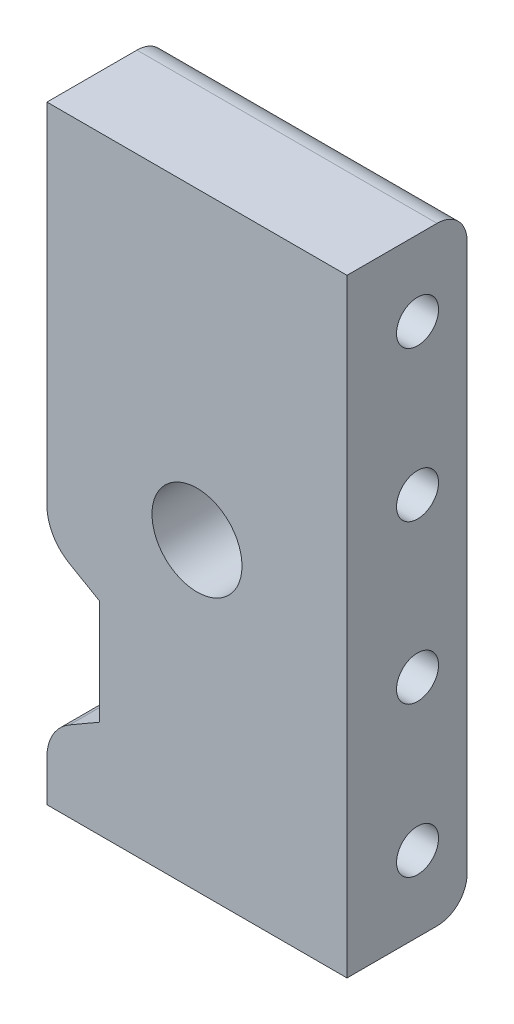
ISO-10303-21;
HEADER;
FILE_DESCRIPTION(('STEP AP214'),'2;1');
FILE_NAME('part.step','',(''),(''),'','','');
FILE_SCHEMA(('AUTOMOTIVE_DESIGN { 1 0 10303 214 1 1 1 1 }'));
ENDSEC;
DATA;
#1=APPLICATION_CONTEXT('core data for automotive mechanical design processes');
#2=APPLICATION_PROTOCOL_DEFINITION('international standard','automotive_design',2000,#1);
#3=PRODUCT_CONTEXT('',#1,'mechanical');
#4=PRODUCT('Part','Part','',(#3));
#5=PRODUCT_RELATED_PRODUCT_CATEGORY('part','',(#4));
#6=PRODUCT_DEFINITION_FORMATION('','',#4);
#7=PRODUCT_DEFINITION_CONTEXT('part definition',#1,'design');
#8=PRODUCT_DEFINITION('design','',#6,#7);
#9=PRODUCT_DEFINITION_SHAPE('','',#8);
#10=(LENGTH_UNIT() NAMED_UNIT(*) SI_UNIT(.MILLI.,.METRE.));
#11=(NAMED_UNIT(*) PLANE_ANGLE_UNIT() SI_UNIT($,.RADIAN.));
#12=(NAMED_UNIT(*) SI_UNIT($,.STERADIAN.) SOLID_ANGLE_UNIT());
#13=UNCERTAINTY_MEASURE_WITH_UNIT(LENGTH_MEASURE(1.E-05),#10,'distance_accuracy_value','');
#14=(GEOMETRIC_REPRESENTATION_CONTEXT(3) GLOBAL_UNCERTAINTY_ASSIGNED_CONTEXT((#13)) GLOBAL_UNIT_ASSIGNED_CONTEXT((#10,
#11,#12)) REPRESENTATION_CONTEXT('',''));
#15=CARTESIAN_POINT('',(0.,0.,0.));
#16=DIRECTION('',(0.,0.,1.));
#17=DIRECTION('',(1.,0.,0.));
#18=AXIS2_PLACEMENT_3D('',#15,#16,#17);
#19=CARTESIAN_POINT('',(-10.,20.28038,-8.));
#20=DIRECTION('',(-1.,0.,0.));
#21=DIRECTION('',(0.,-1.,0.));
#22=AXIS2_PLACEMENT_3D('',#19,#20,#21);
#23=PLANE('',#22);
#24=DIRECTION('',(0.,-1.,0.));
#25=VECTOR('',#24,1.);
#26=CARTESIAN_POINT('',(-10.,20.28038,-8.));
#27=LINE('',#26,#25);
#28=CARTESIAN_POINT('',(-10.,20.28038,-8.));
#29=VERTEX_POINT('',#28);
#30=CARTESIAN_POINT('',(-10.,-3.01239325026743,-8.));
#31=VERTEX_POINT('',#30);
#32=EDGE_CURVE('E197',#29,#31,#27,.T.);
#33=ORIENTED_EDGE('',*,*,#32,.F.);
#34=DIRECTION('',(0.,0.,-1.));
#35=VECTOR('',#34,1.);
#36=CARTESIAN_POINT('',(-10.,20.28038,-8.));
#37=LINE('',#36,#35);
#38=CARTESIAN_POINT('',(-10.,20.28038,-14.));
#39=VERTEX_POINT('',#38);
#40=EDGE_CURVE('E204',#29,#39,#37,.T.);
#41=ORIENTED_EDGE('',*,*,#40,.T.);
#42=CARTESIAN_POINT('',(-10.,18.28038,-14.));
#43=DIRECTION('',(1.,0.,0.));
#44=DIRECTION('',(0.,-1.,0.));
#45=AXIS2_PLACEMENT_3D('',#42,#43,#44);
#46=CIRCLE('',#45,2.);
#47=CARTESIAN_POINT('',(-10.,18.28038,-16.));
#48=VERTEX_POINT('',#47);
#49=EDGE_CURVE('E234',#48,#39,#46,.T.);
#50=ORIENTED_EDGE('',*,*,#49,.F.);
#51=DIRECTION('',(0.,-1.,0.));
#52=VECTOR('',#51,1.);
#53=CARTESIAN_POINT('',(-10.,20.28038,-16.));
#54=LINE('',#53,#52);
#55=CARTESIAN_POINT('',(-10.,-3.01239325026743,-16.));
#56=VERTEX_POINT('',#55);
#57=EDGE_CURVE('E205',#48,#56,#54,.T.);
#58=ORIENTED_EDGE('',*,*,#57,.T.);
#59=DIRECTION('',(0.,0.,-1.));
#60=VECTOR('',#59,1.);
#61=CARTESIAN_POINT('',(-10.,-3.01239325026743,-8.));
#62=LINE('',#61,#60);
#63=EDGE_CURVE('E44',#31,#56,#62,.T.);
#64=ORIENTED_EDGE('',*,*,#63,.F.);
#65=EDGE_LOOP('',(#33,#41,#50,#58,#64));
#66=FACE_BOUND('',#65,.T.);
#67=ADVANCED_FACE('F36',(#66),#23,.T.);
#68=CARTESIAN_POINT('',(9.99999999999999,20.28038,-8.));
#69=DIRECTION('',(0.,1.,0.));
#70=DIRECTION('',(-1.,0.,0.));
#71=AXIS2_PLACEMENT_3D('',#68,#69,#70);
#72=PLANE('',#71);
#73=ORIENTED_EDGE('',*,*,#40,.F.);
#74=DIRECTION('',(-1.,0.,0.));
#75=VECTOR('',#74,1.);
#76=CARTESIAN_POINT('',(9.99999999999999,20.28038,-8.));
#77=LINE('',#76,#75);
#78=CARTESIAN_POINT('',(9.99999999999999,20.28038,-8.));
#79=VERTEX_POINT('',#78);
#80=EDGE_CURVE('E193',#79,#29,#77,.T.);
#81=ORIENTED_EDGE('',*,*,#80,.F.);
#82=DIRECTION('',(0.,0.,-1.));
#83=VECTOR('',#82,1.);
#84=CARTESIAN_POINT('',(9.99999999999999,20.28038,-8.));
#85=LINE('',#84,#83);
#86=CARTESIAN_POINT('',(9.99999999999999,20.28038,-14.));
#87=VERTEX_POINT('',#86);
#88=EDGE_CURVE('E210',#79,#87,#85,.T.);
#89=ORIENTED_EDGE('',*,*,#88,.T.);
#90=DIRECTION('',(-1.,0.,0.));
#91=VECTOR('',#90,1.);
#92=CARTESIAN_POINT('',(9.99999999999999,20.28038,-14.));
#93=LINE('',#92,#91);
#94=EDGE_CURVE('E240',#39,#87,#93,.F.);
#95=ORIENTED_EDGE('',*,*,#94,.F.);
#96=EDGE_LOOP('',(#73,#81,#89,#95));
#97=FACE_BOUND('',#96,.T.);
#98=ADVANCED_FACE('F294',(#97),#72,.T.);
#99=CARTESIAN_POINT('',(9.99999999999999,-20.28038,-8.));
#100=DIRECTION('',(1.,0.,0.));
#101=DIRECTION('',(0.,0.,1.));
#102=AXIS2_PLACEMENT_3D('',#99,#100,#101);
#103=PLANE('',#102);
#104=CARTESIAN_POINT('',(9.99999999999999,-15.26519,-12.7));
#105=DIRECTION('',(-1.,0.,0.));
#106=DIRECTION('',(0.,0.,-1.));
#107=AXIS2_PLACEMENT_3D('',#104,#105,#106);
#108=CIRCLE('',#107,1.4);
#109=CARTESIAN_POINT('',(9.99999999999999,-15.26519,-14.1));
#110=VERTEX_POINT('',#109);
#111=EDGE_CURVE('E173',#110,#110,#108,.T.);
#112=ORIENTED_EDGE('',*,*,#111,.T.);
#113=EDGE_LOOP('',(#112));
#114=FACE_BOUND('',#113,.T.);
#115=CARTESIAN_POINT('',(9.99999999999999,5.26519,-12.7));
#116=DIRECTION('',(-1.,0.,0.));
#117=DIRECTION('',(0.,0.,-1.));
#118=AXIS2_PLACEMENT_3D('',#115,#116,#117);
#119=CIRCLE('',#118,1.4);
#120=CARTESIAN_POINT('',(9.99999999999999,5.26519,-14.1));
#121=VERTEX_POINT('',#120);
#122=EDGE_CURVE('E168',#121,#121,#119,.T.);
#123=ORIENTED_EDGE('',*,*,#122,.T.);
#124=EDGE_LOOP('',(#123));
#125=FACE_BOUND('',#124,.T.);
#126=CARTESIAN_POINT('',(9.99999999999999,15.26519,-12.7));
#127=DIRECTION('',(-1.,0.,0.));
#128=DIRECTION('',(0.,0.,1.));
#129=AXIS2_PLACEMENT_3D('',#126,#127,#128);
#130=CIRCLE('',#129,1.4);
#131=CARTESIAN_POINT('',(9.99999999999999,15.26519,-11.3));
#132=VERTEX_POINT('',#131);
#133=EDGE_CURVE('E180',#132,#132,#130,.T.);
#134=ORIENTED_EDGE('',*,*,#133,.T.);
#135=EDGE_LOOP('',(#134));
#136=FACE_BOUND('',#135,.T.);
#137=CARTESIAN_POINT('',(9.99999999999999,-5.26519,-12.7));
#138=DIRECTION('',(-1.,0.,0.));
#139=DIRECTION('',(0.,0.,1.));
#140=AXIS2_PLACEMENT_3D('',#137,#138,#139);
#141=CIRCLE('',#140,1.4);
#142=CARTESIAN_POINT('',(9.99999999999999,-5.26519,-11.3));
#143=VERTEX_POINT('',#142);
#144=EDGE_CURVE('E185',#143,#143,#141,.T.);
#145=ORIENTED_EDGE('',*,*,#144,.T.);
#146=EDGE_LOOP('',(#145));
#147=FACE_BOUND('',#146,.T.);
#148=DIRECTION('',(0.,1.,0.));
#149=VECTOR('',#148,1.);
#150=CARTESIAN_POINT('',(9.99999999999999,-20.28038,-16.));
#151=LINE('',#150,#149);
#152=CARTESIAN_POINT('',(9.99999999999999,-18.28038,-16.));
#153=VERTEX_POINT('',#152);
#154=CARTESIAN_POINT('',(9.99999999999999,18.28038,-16.));
#155=VERTEX_POINT('',#154);
#156=EDGE_CURVE('E196',#153,#155,#151,.T.);
#157=ORIENTED_EDGE('',*,*,#156,.T.);
#158=CARTESIAN_POINT('',(9.99999999999999,18.28038,-14.));
#159=DIRECTION('',(-1.,0.,0.));
#160=DIRECTION('',(0.,0.,1.));
#161=AXIS2_PLACEMENT_3D('',#158,#159,#160);
#162=CIRCLE('',#161,2.);
#163=EDGE_CURVE('E225',#87,#155,#162,.T.);
#164=ORIENTED_EDGE('',*,*,#163,.F.);
#165=ORIENTED_EDGE('',*,*,#88,.F.);
#166=DIRECTION('',(0.,1.,0.));
#167=VECTOR('',#166,1.);
#168=CARTESIAN_POINT('',(9.99999999999999,-20.28038,-8.));
#169=LINE('',#168,#167);
#170=CARTESIAN_POINT('',(9.99999999999999,-20.28038,-8.));
#171=VERTEX_POINT('',#170);
#172=EDGE_CURVE('E202',#171,#79,#169,.T.);
#173=ORIENTED_EDGE('',*,*,#172,.F.);
#174=DIRECTION('',(0.,0.,-1.));
#175=VECTOR('',#174,1.);
#176=CARTESIAN_POINT('',(9.99999999999999,-20.28038,-8.));
#177=LINE('',#176,#175);
#178=CARTESIAN_POINT('',(9.99999999999999,-20.28038,-14.));
#179=VERTEX_POINT('',#178);
#180=EDGE_CURVE('E214',#171,#179,#177,.T.);
#181=ORIENTED_EDGE('',*,*,#180,.T.);
#182=CARTESIAN_POINT('',(9.99999999999999,-18.28038,-14.));
#183=DIRECTION('',(-1.,0.,0.));
#184=DIRECTION('',(0.,0.,1.));
#185=AXIS2_PLACEMENT_3D('',#182,#183,#184);
#186=CIRCLE('',#185,2.);
#187=EDGE_CURVE('E228',#153,#179,#186,.T.);
#188=ORIENTED_EDGE('',*,*,#187,.F.);
#189=EDGE_LOOP('',(#157,#164,#165,#173,#181,#188));
#190=FACE_BOUND('',#189,.T.);
#191=ADVANCED_FACE('F273',(#114,#125,#136,#147,#190),#103,.T.);
#192=CARTESIAN_POINT('',(-10.,-20.28038,-8.));
#193=DIRECTION('',(0.,-1.,0.));
#194=DIRECTION('',(0.,0.,1.));
#195=AXIS2_PLACEMENT_3D('',#192,#193,#194);
#196=PLANE('',#195);
#197=ORIENTED_EDGE('',*,*,#180,.F.);
#198=DIRECTION('',(1.,0.,0.));
#199=VECTOR('',#198,1.);
#200=CARTESIAN_POINT('',(-10.,-20.28038,-8.));
#201=LINE('',#200,#199);
#202=CARTESIAN_POINT('',(-10.,-20.28038,-8.));
#203=VERTEX_POINT('',#202);
#204=EDGE_CURVE('E200',#203,#171,#201,.T.);
#205=ORIENTED_EDGE('',*,*,#204,.F.);
#206=DIRECTION('',(0.,0.,-1.));
#207=VECTOR('',#206,1.);
#208=CARTESIAN_POINT('',(-10.,-20.28038,-8.));
#209=LINE('',#208,#207);
#210=CARTESIAN_POINT('',(-10.,-20.28038,-14.));
#211=VERTEX_POINT('',#210);
#212=EDGE_CURVE('E217',#203,#211,#209,.T.);
#213=ORIENTED_EDGE('',*,*,#212,.T.);
#214=DIRECTION('',(1.,0.,0.));
#215=VECTOR('',#214,1.);
#216=CARTESIAN_POINT('',(-10.,-20.28038,-14.));
#217=LINE('',#216,#215);
#218=EDGE_CURVE('E231',#179,#211,#217,.F.);
#219=ORIENTED_EDGE('',*,*,#218,.F.);
#220=EDGE_LOOP('',(#197,#205,#213,#219));
#221=FACE_BOUND('',#220,.T.);
#222=ADVANCED_FACE('F290',(#221),#196,.T.);
#223=CARTESIAN_POINT('',(-10.,-17.5179467497326,-16.));
#224=VERTEX_POINT('',#223);
#225=CARTESIAN_POINT('',(-10.,-18.28038,-16.));
#226=VERTEX_POINT('',#225);
#227=EDGE_CURVE('E172',#224,#226,#54,.T.);
#228=ORIENTED_EDGE('',*,*,#227,.T.);
#229=CARTESIAN_POINT('',(-10.,-18.28038,-14.));
#230=DIRECTION('',(1.,0.,0.));
#231=DIRECTION('',(0.,-1.,0.));
#232=AXIS2_PLACEMENT_3D('',#229,#230,#231);
#233=CIRCLE('',#232,2.);
#234=EDGE_CURVE('E237',#211,#226,#233,.T.);
#235=ORIENTED_EDGE('',*,*,#234,.F.);
#236=ORIENTED_EDGE('',*,*,#212,.F.);
#237=CARTESIAN_POINT('',(-10.,-17.5179467497326,-8.));
#238=VERTEX_POINT('',#237);
#239=EDGE_CURVE('E195',#238,#203,#27,.T.);
#240=ORIENTED_EDGE('',*,*,#239,.F.);
#241=DIRECTION('',(0.,0.,1.));
#242=VECTOR('',#241,1.);
#243=CARTESIAN_POINT('',(-10.,-17.5179467497326,-8.));
#244=LINE('',#243,#242);
#245=EDGE_CURVE('E143',#224,#238,#244,.T.);
#246=ORIENTED_EDGE('',*,*,#245,.F.);
#247=EDGE_LOOP('',(#228,#235,#236,#240,#246));
#248=FACE_BOUND('',#247,.T.);
#249=ADVANCED_FACE('F283',(#248),#23,.T.);
#250=CARTESIAN_POINT('',(0.,0.,-8.));
#251=DIRECTION('',(0.,0.,-1.));
#252=DIRECTION('',(1.,0.,0.));
#253=AXIS2_PLACEMENT_3D('',#250,#251,#252);
#254=PLANE('',#253);
#255=CARTESIAN_POINT('',(0.,0.,-8.));
#256=DIRECTION('',(0.,0.,1.));
#257=DIRECTION('',(1.,0.,0.));
#258=AXIS2_PLACEMENT_3D('',#255,#256,#257);
#259=CIRCLE('',#258,3.);
#260=CARTESIAN_POINT('',(3.,0.,-8.));
#261=VERTEX_POINT('',#260);
#262=EDGE_CURVE('E156',#261,#261,#259,.F.);
#263=ORIENTED_EDGE('',*,*,#262,.T.);
#264=EDGE_LOOP('',(#263));
#265=FACE_BOUND('',#264,.T.);
#266=ORIENTED_EDGE('',*,*,#239,.T.);
#267=ORIENTED_EDGE('',*,*,#204,.T.);
#268=ORIENTED_EDGE('',*,*,#172,.T.);
#269=ORIENTED_EDGE('',*,*,#80,.T.);
#270=ORIENTED_EDGE('',*,*,#32,.T.);
#271=CARTESIAN_POINT('',(-7.,-3.01239325026743,-8.));
#272=DIRECTION('',(0.,0.,1.));
#273=DIRECTION('',(1.,0.,0.));
#274=AXIS2_PLACEMENT_3D('',#271,#272,#273);
#275=CIRCLE('',#274,3.);
#276=CARTESIAN_POINT('',(-8.49999999999999,-5.61046946162074,-8.));
#277=VERTEX_POINT('',#276);
#278=EDGE_CURVE('E253',#277,#31,#275,.F.);
#279=ORIENTED_EDGE('',*,*,#278,.F.);
#280=DIRECTION('',(-0.86602540378444,0.499999999999998,0.));
#281=VECTOR('',#280,1.);
#282=CARTESIAN_POINT('',(-6.49999999999997,-6.76517,-8.));
#283=LINE('',#282,#281);
#284=CARTESIAN_POINT('',(-6.5,-6.76517,-8.));
#285=VERTEX_POINT('',#284);
#286=EDGE_CURVE('E144',#285,#277,#283,.T.);
#287=ORIENTED_EDGE('',*,*,#286,.F.);
#288=DIRECTION('',(0.,-1.,0.));
#289=VECTOR('',#288,1.);
#290=CARTESIAN_POINT('',(-6.5,-13.76517,-8.));
#291=LINE('',#290,#289);
#292=CARTESIAN_POINT('',(-6.5,-13.76517,-8.));
#293=VERTEX_POINT('',#292);
#294=EDGE_CURVE('E129',#285,#293,#291,.T.);
#295=ORIENTED_EDGE('',*,*,#294,.T.);
#296=DIRECTION('',(0.86602540378444,0.499999999999998,0.));
#297=VECTOR('',#296,1.);
#298=CARTESIAN_POINT('',(-6.49999999999999,-13.76517,-8.));
#299=LINE('',#298,#297);
#300=CARTESIAN_POINT('',(-8.5,-14.9198705383793,-8.));
#301=VERTEX_POINT('',#300);
#302=EDGE_CURVE('E138',#301,#293,#299,.T.);
#303=ORIENTED_EDGE('',*,*,#302,.F.);
#304=CARTESIAN_POINT('',(-7.,-17.5179467497326,-8.));
#305=DIRECTION('',(0.,0.,1.));
#306=DIRECTION('',(1.,0.,0.));
#307=AXIS2_PLACEMENT_3D('',#304,#305,#306);
#308=CIRCLE('',#307,3.);
#309=EDGE_CURVE('E255',#238,#301,#308,.F.);
#310=ORIENTED_EDGE('',*,*,#309,.F.);
#311=EDGE_LOOP('',(#266,#267,#268,#269,#270,#279,#287,#295,#303,#310));
#312=FACE_BOUND('',#311,.T.);
#313=ADVANCED_FACE('F146',(#265,#312),#254,.F.);
#314=CARTESIAN_POINT('',(0.,0.,-16.));
#315=DIRECTION('',(0.,0.,-1.));
#316=DIRECTION('',(1.,0.,0.));
#317=AXIS2_PLACEMENT_3D('',#314,#315,#316);
#318=PLANE('',#317);
#319=DIRECTION('',(-0.86602540378444,-0.499999999999998,0.));
#320=VECTOR('',#319,1.);
#321=CARTESIAN_POINT('',(4.33549345370572,-7.50929493770061,-16.));
#322=LINE('',#321,#320);
#323=CARTESIAN_POINT('',(-6.5,-13.76517,-16.));
#324=VERTEX_POINT('',#323);
#325=CARTESIAN_POINT('',(-8.5,-14.9198705383793,-16.));
#326=VERTEX_POINT('',#325);
#327=EDGE_CURVE('E248',#324,#326,#322,.T.);
#328=ORIENTED_EDGE('',*,*,#327,.F.);
#329=DIRECTION('',(0.,1.,0.));
#330=VECTOR('',#329,1.);
#331=CARTESIAN_POINT('',(-6.5,-6.76517,-16.));
#332=LINE('',#331,#330);
#333=CARTESIAN_POINT('',(-6.5,-6.76517,-16.));
#334=VERTEX_POINT('',#333);
#335=EDGE_CURVE('E132',#324,#334,#332,.T.);
#336=ORIENTED_EDGE('',*,*,#335,.T.);
#337=DIRECTION('',(0.86602540378444,-0.499999999999998,0.));
#338=VECTOR('',#337,1.);
#339=CARTESIAN_POINT('',(-4.55440454046015,-7.88846006229942,-16.));
#340=LINE('',#339,#338);
#341=CARTESIAN_POINT('',(-8.5,-5.61046946162074,-16.));
#342=VERTEX_POINT('',#341);
#343=EDGE_CURVE('E246',#342,#334,#340,.T.);
#344=ORIENTED_EDGE('',*,*,#343,.F.);
#345=CARTESIAN_POINT('',(-7.,-3.01239325026743,-16.));
#346=DIRECTION('',(0.,0.,1.));
#347=DIRECTION('',(1.,0.,0.));
#348=AXIS2_PLACEMENT_3D('',#345,#346,#347);
#349=CIRCLE('',#348,3.);
#350=EDGE_CURVE('E56',#56,#342,#349,.T.);
#351=ORIENTED_EDGE('',*,*,#350,.F.);
#352=ORIENTED_EDGE('',*,*,#57,.F.);
#353=DIRECTION('',(-1.,0.,0.));
#354=VECTOR('',#353,1.);
#355=CARTESIAN_POINT('',(0.,18.28038,-16.));
#356=LINE('',#355,#354);
#357=EDGE_CURVE('E213',#155,#48,#356,.T.);
#358=ORIENTED_EDGE('',*,*,#357,.F.);
#359=ORIENTED_EDGE('',*,*,#156,.F.);
#360=DIRECTION('',(1.,0.,0.));
#361=VECTOR('',#360,1.);
#362=CARTESIAN_POINT('',(0.,-18.28038,-16.));
#363=LINE('',#362,#361);
#364=EDGE_CURVE('E223',#226,#153,#363,.T.);
#365=ORIENTED_EDGE('',*,*,#364,.F.);
#366=ORIENTED_EDGE('',*,*,#227,.F.);
#367=CARTESIAN_POINT('',(-7.,-17.5179467497326,-16.));
#368=DIRECTION('',(0.,0.,1.));
#369=DIRECTION('',(1.,0.,0.));
#370=AXIS2_PLACEMENT_3D('',#367,#368,#369);
#371=CIRCLE('',#370,3.);
#372=EDGE_CURVE('E259',#326,#224,#371,.T.);
#373=ORIENTED_EDGE('',*,*,#372,.F.);
#374=EDGE_LOOP('',(#328,#336,#344,#351,#352,#358,#359,#365,#366,#373));
#375=FACE_BOUND('',#374,.T.);
#376=CARTESIAN_POINT('',(0.,0.,-16.));
#377=DIRECTION('',(0.,0.,1.));
#378=DIRECTION('',(1.,0.,0.));
#379=AXIS2_PLACEMENT_3D('',#376,#377,#378);
#380=CIRCLE('',#379,9.3);
#381=CARTESIAN_POINT('',(9.29999999999999,0.,-16.));
#382=VERTEX_POINT('',#381);
#383=EDGE_CURVE('E243',#382,#382,#380,.F.);
#384=ORIENTED_EDGE('',*,*,#383,.F.);
#385=EDGE_LOOP('',(#384));
#386=FACE_BOUND('',#385,.T.);
#387=ADVANCED_FACE('F265',(#375,#386),#318,.T.);
#388=CARTESIAN_POINT('',(0.,-5.26519,-12.7));
#389=DIRECTION('',(1.,0.,0.));
#390=DIRECTION('',(0.,0.,1.));
#391=AXIS2_PLACEMENT_3D('',#388,#389,#390);
#392=CYLINDRICAL_SURFACE('',#391,1.4);
#393=CARTESIAN_POINT('',(0.,-5.26519,-12.7));
#394=DIRECTION('',(-1.,0.,0.));
#395=DIRECTION('',(0.,0.,1.));
#396=AXIS2_PLACEMENT_3D('',#393,#394,#395);
#397=CIRCLE('',#396,1.4);
#398=CARTESIAN_POINT('',(0.,-5.26519,-11.3));
#399=VERTEX_POINT('',#398);
#400=EDGE_CURVE('E176',#399,#399,#397,.T.);
#401=ORIENTED_EDGE('',*,*,#400,.T.);
#402=EDGE_LOOP('',(#401));
#403=FACE_BOUND('',#402,.T.);
#404=ORIENTED_EDGE('',*,*,#144,.F.);
#405=EDGE_LOOP('',(#404));
#406=FACE_BOUND('',#405,.T.);
#407=ADVANCED_FACE('F479',(#403,#406),#392,.F.);
#408=CARTESIAN_POINT('',(0.,-5.26519,-12.7));
#409=DIRECTION('',(1.,0.,0.));
#410=DIRECTION('',(0.,0.,1.));
#411=AXIS2_PLACEMENT_3D('',#408,#409,#410);
#412=PLANE('',#411);
#413=ORIENTED_EDGE('',*,*,#400,.F.);
#414=EDGE_LOOP('',(#413));
#415=FACE_BOUND('',#414,.T.);
#416=ADVANCED_FACE('F469',(#415),#412,.T.);
#417=CARTESIAN_POINT('',(0.,15.26519,-12.7));
#418=DIRECTION('',(1.,0.,0.));
#419=DIRECTION('',(0.,0.,1.));
#420=AXIS2_PLACEMENT_3D('',#417,#418,#419);
#421=CYLINDRICAL_SURFACE('',#420,1.4);
#422=CARTESIAN_POINT('',(0.,15.26519,-12.7));
#423=DIRECTION('',(-1.,0.,0.));
#424=DIRECTION('',(0.,0.,1.));
#425=AXIS2_PLACEMENT_3D('',#422,#423,#424);
#426=CIRCLE('',#425,1.4);
#427=CARTESIAN_POINT('',(0.,15.26519,-11.3));
#428=VERTEX_POINT('',#427);
#429=EDGE_CURVE('E188',#428,#428,#426,.T.);
#430=ORIENTED_EDGE('',*,*,#429,.T.);
#431=EDGE_LOOP('',(#430));
#432=FACE_BOUND('',#431,.T.);
#433=ORIENTED_EDGE('',*,*,#133,.F.);
#434=EDGE_LOOP('',(#433));
#435=FACE_BOUND('',#434,.T.);
#436=ADVANCED_FACE('F458',(#432,#435),#421,.F.);
#437=CARTESIAN_POINT('',(0.,15.26519,-12.7));
#438=DIRECTION('',(1.,0.,0.));
#439=DIRECTION('',(0.,0.,1.));
#440=AXIS2_PLACEMENT_3D('',#437,#438,#439);
#441=PLANE('',#440);
#442=ORIENTED_EDGE('',*,*,#429,.F.);
#443=EDGE_LOOP('',(#442));
#444=FACE_BOUND('',#443,.T.);
#445=ADVANCED_FACE('F447',(#444),#441,.T.);
#446=CARTESIAN_POINT('',(0.,5.26519,-12.7));
#447=DIRECTION('',(1.,0.,0.));
#448=DIRECTION('',(0.,0.,1.));
#449=AXIS2_PLACEMENT_3D('',#446,#447,#448);
#450=CYLINDRICAL_SURFACE('',#449,1.4);
#451=CARTESIAN_POINT('',(0.,5.26519,-12.7));
#452=DIRECTION('',(-1.,0.,0.));
#453=DIRECTION('',(0.,0.,-1.));
#454=AXIS2_PLACEMENT_3D('',#451,#452,#453);
#455=CIRCLE('',#454,1.4);
#456=CARTESIAN_POINT('',(0.,5.26519,-14.1));
#457=VERTEX_POINT('',#456);
#458=EDGE_CURVE('E177',#457,#457,#455,.T.);
#459=ORIENTED_EDGE('',*,*,#458,.T.);
#460=EDGE_LOOP('',(#459));
#461=FACE_BOUND('',#460,.T.);
#462=ORIENTED_EDGE('',*,*,#122,.F.);
#463=EDGE_LOOP('',(#462));
#464=FACE_BOUND('',#463,.T.);
#465=ADVANCED_FACE('F437',(#461,#464),#450,.F.);
#466=CARTESIAN_POINT('',(0.,5.26519,-12.7));
#467=DIRECTION('',(-1.,0.,0.));
#468=DIRECTION('',(0.,0.,-1.));
#469=AXIS2_PLACEMENT_3D('',#466,#467,#468);
#470=PLANE('',#469);
#471=ORIENTED_EDGE('',*,*,#458,.F.);
#472=EDGE_LOOP('',(#471));
#473=FACE_BOUND('',#472,.T.);
#474=ADVANCED_FACE('F427',(#473),#470,.F.);
#475=CARTESIAN_POINT('',(0.,-15.26519,-12.7));
#476=DIRECTION('',(1.,0.,0.));
#477=DIRECTION('',(0.,0.,1.));
#478=AXIS2_PLACEMENT_3D('',#475,#476,#477);
#479=CYLINDRICAL_SURFACE('',#478,1.4);
#480=CARTESIAN_POINT('',(0.,-15.26519,-12.7));
#481=DIRECTION('',(-1.,0.,0.));
#482=DIRECTION('',(0.,0.,-1.));
#483=AXIS2_PLACEMENT_3D('',#480,#481,#482);
#484=CIRCLE('',#483,1.4);
#485=CARTESIAN_POINT('',(0.,-15.26519,-14.1));
#486=VERTEX_POINT('',#485);
#487=EDGE_CURVE('E169',#486,#486,#484,.T.);
#488=ORIENTED_EDGE('',*,*,#487,.T.);
#489=EDGE_LOOP('',(#488));
#490=FACE_BOUND('',#489,.T.);
#491=ORIENTED_EDGE('',*,*,#111,.F.);
#492=EDGE_LOOP('',(#491));
#493=FACE_BOUND('',#492,.T.);
#494=ADVANCED_FACE('F417',(#490,#493),#479,.F.);
#495=CARTESIAN_POINT('',(0.,-15.26519,-12.7));
#496=DIRECTION('',(-1.,0.,0.));
#497=DIRECTION('',(0.,0.,-1.));
#498=AXIS2_PLACEMENT_3D('',#495,#496,#497);
#499=PLANE('',#498);
#500=ORIENTED_EDGE('',*,*,#487,.F.);
#501=EDGE_LOOP('',(#500));
#502=FACE_BOUND('',#501,.T.);
#503=ADVANCED_FACE('F407',(#502),#499,.F.);
#504=CARTESIAN_POINT('',(0.,0.,-18.5));
#505=DIRECTION('',(0.,0.,-1.));
#506=DIRECTION('',(1.,0.,0.));
#507=AXIS2_PLACEMENT_3D('',#504,#505,#506);
#508=PLANE('',#507);
#509=CARTESIAN_POINT('',(0.,0.,-18.5));
#510=DIRECTION('',(0.,0.,1.));
#511=DIRECTION('',(1.,0.,0.));
#512=AXIS2_PLACEMENT_3D('',#509,#510,#511);
#513=CIRCLE('',#512,5.1);
#514=CARTESIAN_POINT('',(5.1,0.,-18.5));
#515=VERTEX_POINT('',#514);
#516=EDGE_CURVE('E159',#515,#515,#513,.T.);
#517=ORIENTED_EDGE('',*,*,#516,.T.);
#518=EDGE_LOOP('',(#517));
#519=FACE_BOUND('',#518,.T.);
#520=CARTESIAN_POINT('',(0.,0.,-18.5));
#521=DIRECTION('',(0.,0.,1.));
#522=DIRECTION('',(1.,0.,0.));
#523=AXIS2_PLACEMENT_3D('',#520,#521,#522);
#524=CIRCLE('',#523,7.5);
#525=CARTESIAN_POINT('',(7.5,0.,-18.5));
#526=VERTEX_POINT('',#525);
#527=EDGE_CURVE('E163',#526,#526,#524,.T.);
#528=ORIENTED_EDGE('',*,*,#527,.F.);
#529=EDGE_LOOP('',(#528));
#530=FACE_BOUND('',#529,.T.);
#531=ADVANCED_FACE('F397',(#519,#530),#508,.T.);
#532=CARTESIAN_POINT('',(0.,0.,-14.5));
#533=DIRECTION('',(0.,0.,-1.));
#534=DIRECTION('',(1.,0.,0.));
#535=AXIS2_PLACEMENT_3D('',#532,#533,#534);
#536=CYLINDRICAL_SURFACE('',#535,5.1);
#537=CARTESIAN_POINT('',(0.,0.,-14.5));
#538=DIRECTION('',(0.,0.,1.));
#539=DIRECTION('',(1.,0.,0.));
#540=AXIS2_PLACEMENT_3D('',#537,#538,#539);
#541=CIRCLE('',#540,5.1);
#542=CARTESIAN_POINT('',(5.1,0.,-14.5));
#543=VERTEX_POINT('',#542);
#544=EDGE_CURVE('E160',#543,#543,#541,.T.);
#545=ORIENTED_EDGE('',*,*,#544,.T.);
#546=EDGE_LOOP('',(#545));
#547=FACE_BOUND('',#546,.T.);
#548=ORIENTED_EDGE('',*,*,#516,.F.);
#549=EDGE_LOOP('',(#548));
#550=FACE_BOUND('',#549,.T.);
#551=ADVANCED_FACE('F387',(#547,#550),#536,.F.);
#552=CARTESIAN_POINT('',(0.,0.,-14.5));
#553=DIRECTION('',(0.,0.,-1.));
#554=DIRECTION('',(1.,0.,0.));
#555=AXIS2_PLACEMENT_3D('',#552,#553,#554);
#556=PLANE('',#555);
#557=CARTESIAN_POINT('',(0.,0.,-14.5));
#558=DIRECTION('',(0.,0.,1.));
#559=DIRECTION('',(1.,0.,0.));
#560=AXIS2_PLACEMENT_3D('',#557,#558,#559);
#561=CIRCLE('',#560,3.);
#562=CARTESIAN_POINT('',(3.,0.,-14.5));
#563=VERTEX_POINT('',#562);
#564=EDGE_CURVE('E153',#563,#563,#561,.T.);
#565=ORIENTED_EDGE('',*,*,#564,.T.);
#566=EDGE_LOOP('',(#565));
#567=FACE_BOUND('',#566,.T.);
#568=ORIENTED_EDGE('',*,*,#544,.F.);
#569=EDGE_LOOP('',(#568));
#570=FACE_BOUND('',#569,.T.);
#571=ADVANCED_FACE('F377',(#567,#570),#556,.T.);
#572=CARTESIAN_POINT('',(0.,0.,0.485281374238571));
#573=DIRECTION('',(0.,0.,-1.));
#574=DIRECTION('',(1.,0.,0.));
#575=AXIS2_PLACEMENT_3D('',#572,#573,#574);
#576=CYLINDRICAL_SURFACE('',#575,3.);
#577=CARTESIAN_POINT('',(3.,0.,-8.));
#578=CARTESIAN_POINT('',(3.,0.,-8.06770833333333));
#579=CARTESIAN_POINT('',(3.,0.,-8.13541666666667));
#580=CARTESIAN_POINT('',(3.,0.,-8.27083333333334));
#581=CARTESIAN_POINT('',(3.,0.,-8.33854166666667));
#582=CARTESIAN_POINT('',(3.,0.,-8.47395833333334));
#583=CARTESIAN_POINT('',(3.,0.,-8.54166666666667));
#584=CARTESIAN_POINT('',(3.,0.,-8.67708333333334));
#585=CARTESIAN_POINT('',(3.,0.,-8.74479166666667));
#586=CARTESIAN_POINT('',(3.,0.,-8.88020833333334));
#587=CARTESIAN_POINT('',(3.,0.,-8.94791666666667));
#588=CARTESIAN_POINT('',(3.,0.,-9.08333333333333));
#589=CARTESIAN_POINT('',(3.,0.,-9.15104166666667));
#590=CARTESIAN_POINT('',(3.,0.,-9.28645833333333));
#591=CARTESIAN_POINT('',(3.,0.,-9.35416666666667));
#592=CARTESIAN_POINT('',(3.,0.,-9.48958333333333));
#593=CARTESIAN_POINT('',(3.,0.,-9.55729166666667));
#594=CARTESIAN_POINT('',(3.,0.,-9.69270833333333));
#595=CARTESIAN_POINT('',(3.,0.,-9.76041666666667));
#596=CARTESIAN_POINT('',(3.,0.,-9.89583333333333));
#597=CARTESIAN_POINT('',(3.,0.,-9.96354166666667));
#598=CARTESIAN_POINT('',(3.,0.,-10.0989583333333));
#599=CARTESIAN_POINT('',(3.,0.,-10.1666666666667));
#600=CARTESIAN_POINT('',(3.,0.,-10.3020833333333));
#601=CARTESIAN_POINT('',(3.,0.,-10.3697916666667));
#602=CARTESIAN_POINT('',(3.,0.,-10.5052083333333));
#603=CARTESIAN_POINT('',(3.,0.,-10.5729166666667));
#604=CARTESIAN_POINT('',(3.,0.,-10.7083333333333));
#605=CARTESIAN_POINT('',(3.,0.,-10.7760416666667));
#606=CARTESIAN_POINT('',(3.,0.,-10.9114583333333));
#607=CARTESIAN_POINT('',(3.,0.,-10.9791666666667));
#608=CARTESIAN_POINT('',(3.,0.,-11.1145833333333));
#609=CARTESIAN_POINT('',(3.,0.,-11.1822916666667));
#610=CARTESIAN_POINT('',(3.,0.,-11.3177083333333));
#611=CARTESIAN_POINT('',(3.,0.,-11.3854166666667));
#612=CARTESIAN_POINT('',(3.,0.,-11.5208333333333));
#613=CARTESIAN_POINT('',(3.,0.,-11.5885416666667));
#614=CARTESIAN_POINT('',(3.,0.,-11.7239583333333));
#615=CARTESIAN_POINT('',(3.,0.,-11.7916666666667));
#616=CARTESIAN_POINT('',(3.,0.,-11.9270833333333));
#617=CARTESIAN_POINT('',(3.,0.,-11.9947916666667));
#618=CARTESIAN_POINT('',(3.,0.,-12.1302083333333));
#619=CARTESIAN_POINT('',(3.,0.,-12.1979166666667));
#620=CARTESIAN_POINT('',(3.,0.,-12.3333333333333));
#621=CARTESIAN_POINT('',(3.,0.,-12.4010416666667));
#622=CARTESIAN_POINT('',(3.,0.,-12.5364583333333));
#623=CARTESIAN_POINT('',(3.,0.,-12.6041666666667));
#624=CARTESIAN_POINT('',(3.,0.,-12.7395833333333));
#625=CARTESIAN_POINT('',(3.,0.,-12.8072916666667));
#626=CARTESIAN_POINT('',(3.,0.,-12.9427083333333));
#627=CARTESIAN_POINT('',(3.,0.,-13.0104166666667));
#628=CARTESIAN_POINT('',(3.,0.,-13.1458333333333));
#629=CARTESIAN_POINT('',(3.,0.,-13.2135416666667));
#630=CARTESIAN_POINT('',(3.,0.,-13.3489583333333));
#631=CARTESIAN_POINT('',(3.,0.,-13.4166666666667));
#632=CARTESIAN_POINT('',(3.,0.,-13.5520833333333));
#633=CARTESIAN_POINT('',(3.,0.,-13.6197916666667));
#634=CARTESIAN_POINT('',(3.,0.,-13.7552083333333));
#635=CARTESIAN_POINT('',(3.,0.,-13.8229166666667));
#636=CARTESIAN_POINT('',(3.,0.,-13.9583333333333));
#637=CARTESIAN_POINT('',(3.,0.,-14.0260416666667));
#638=CARTESIAN_POINT('',(3.,0.,-14.1614583333333));
#639=CARTESIAN_POINT('',(3.,0.,-14.2291666666667));
#640=CARTESIAN_POINT('',(3.,0.,-14.3645833333333));
#641=CARTESIAN_POINT('',(3.,0.,-14.4322916666667));
#642=CARTESIAN_POINT('',(3.,0.,-14.5));
#643=B_SPLINE_CURVE_WITH_KNOTS('',3,(#577,#578,#579,#580,#581,#582,#583,#584,#585,#586,#587,
#588,#589,#590,#591,#592,#593,#594,#595,#596,#597,#598,#599,#600,#601,#602,#603,#604,#605,#606,
#607,#608,#609,#610,#611,#612,#613,#614,#615,#616,#617,#618,#619,#620,#621,#622,#623,#624,#625,
#626,#627,#628,#629,#630,#631,#632,#633,#634,#635,#636,#637,#638,#639,#640,#641,#642),
.UNSPECIFIED.,.F.,.F.,(4,2,2,2,2,2,2,2,2,2,2,2,2,2,2,2,2,2,2,2,2,2,2,2,2,2,2,2,2,2,2,2,4),(0.,
0.203125,0.40625,0.609375000000001,0.812500000000001,1.015625,1.21875,1.421875,1.625,1.828125,
2.03125,2.234375,2.4375,2.640625,2.84375,3.046875,3.25,3.453125,3.65625,3.859375,4.0625,
4.265625,4.46875,4.671875,4.875,5.078125,5.28125,5.484375,5.6875,5.890625,6.09375,6.296875,6.5),.UNSPECIFIED.);
#644=EDGE_CURVE('BSEAM308',#261,#563,#643,.T.);
#645=ORIENTED_EDGE('',*,*,#262,.F.);
#646=ORIENTED_EDGE('',*,*,#564,.F.);
#647=ORIENTED_EDGE('',*,*,#644,.T.);
#648=ORIENTED_EDGE('',*,*,#644,.F.);
#649=EDGE_LOOP('',(#645,#647,#646,#648));
#650=FACE_BOUND('',#649,.T.);
#651=ADVANCED_FACE('F308',(#650),#576,.F.);
#652=CARTESIAN_POINT('',(0.,-18.28038,-14.));
#653=DIRECTION('',(1.,0.,0.));
#654=DIRECTION('',(0.,0.,1.));
#655=AXIS2_PLACEMENT_3D('',#652,#653,#654);
#656=CYLINDRICAL_SURFACE('',#655,2.);
#657=ORIENTED_EDGE('',*,*,#234,.T.);
#658=ORIENTED_EDGE('',*,*,#364,.T.);
#659=ORIENTED_EDGE('',*,*,#187,.T.);
#660=ORIENTED_EDGE('',*,*,#218,.T.);
#661=EDGE_LOOP('',(#657,#658,#659,#660));
#662=FACE_BOUND('',#661,.T.);
#663=ADVANCED_FACE('F277',(#662),#656,.T.);
#664=CARTESIAN_POINT('',(0.,18.28038,-14.));
#665=DIRECTION('',(-1.,0.,0.));
#666=DIRECTION('',(0.,-1.,0.));
#667=AXIS2_PLACEMENT_3D('',#664,#665,#666);
#668=CYLINDRICAL_SURFACE('',#667,2.);
#669=ORIENTED_EDGE('',*,*,#163,.T.);
#670=ORIENTED_EDGE('',*,*,#357,.T.);
#671=ORIENTED_EDGE('',*,*,#49,.T.);
#672=ORIENTED_EDGE('',*,*,#94,.T.);
#673=EDGE_LOOP('',(#669,#670,#671,#672));
#674=FACE_BOUND('',#673,.T.);
#675=ADVANCED_FACE('F269',(#674),#668,.T.);
#676=CARTESIAN_POINT('',(0.,0.,-18.5));
#677=DIRECTION('',(0.,0.,1.));
#678=DIRECTION('',(-1.,0.,0.));
#679=AXIS2_PLACEMENT_3D('',#676,#677,#678);
#680=CONICAL_SURFACE('',#679,7.5,0.624023052976758);
#681=ORIENTED_EDGE('',*,*,#383,.T.);
#682=EDGE_LOOP('',(#681));
#683=FACE_BOUND('',#682,.T.);
#684=ORIENTED_EDGE('',*,*,#527,.T.);
#685=EDGE_LOOP('',(#684));
#686=FACE_BOUND('',#685,.T.);
#687=ADVANCED_FACE('F311',(#683,#686),#680,.T.);
#688=CARTESIAN_POINT('',(-6.5,0.,-16.));
#689=DIRECTION('',(1.,0.,0.));
#690=DIRECTION('',(0.,0.,1.));
#691=AXIS2_PLACEMENT_3D('',#688,#689,#690);
#692=PLANE('',#691);
#693=ORIENTED_EDGE('',*,*,#294,.F.);
#694=DIRECTION('',(0.,0.,1.));
#695=VECTOR('',#694,1.);
#696=CARTESIAN_POINT('',(-6.5,-6.76517,-8.));
#697=LINE('',#696,#695);
#698=EDGE_CURVE('E151',#334,#285,#697,.T.);
#699=ORIENTED_EDGE('',*,*,#698,.F.);
#700=ORIENTED_EDGE('',*,*,#335,.F.);
#701=DIRECTION('',(0.,0.,-1.));
#702=VECTOR('',#701,1.);
#703=CARTESIAN_POINT('',(-6.5,-13.76517,-8.));
#704=LINE('',#703,#702);
#705=EDGE_CURVE('E125',#293,#324,#704,.T.);
#706=ORIENTED_EDGE('',*,*,#705,.F.);
#707=EDGE_LOOP('',(#693,#699,#700,#706));
#708=FACE_BOUND('',#707,.T.);
#709=ADVANCED_FACE('F127',(#708),#692,.F.);
#710=CARTESIAN_POINT('',(-6.49999999999999,-13.76517,-8.));
#711=DIRECTION('',(-0.499999999999998,0.86602540378444,0.));
#712=DIRECTION('',(0.,0.,1.));
#713=AXIS2_PLACEMENT_3D('',#710,#711,#712);
#714=PLANE('',#713);
#715=ORIENTED_EDGE('',*,*,#302,.T.);
#716=ORIENTED_EDGE('',*,*,#705,.T.);
#717=ORIENTED_EDGE('',*,*,#327,.T.);
#718=DIRECTION('',(0.,0.,1.));
#719=VECTOR('',#718,1.);
#720=CARTESIAN_POINT('',(-8.5,-14.9198705383793,-8.));
#721=LINE('',#720,#719);
#722=EDGE_CURVE('E140',#301,#326,#721,.F.);
#723=ORIENTED_EDGE('',*,*,#722,.F.);
#724=EDGE_LOOP('',(#715,#716,#717,#723));
#725=FACE_BOUND('',#724,.T.);
#726=ADVANCED_FACE('F139',(#725),#714,.T.);
#727=CARTESIAN_POINT('',(-6.49999999999997,-6.76517,-8.));
#728=DIRECTION('',(-0.499999999999998,-0.86602540378444,0.));
#729=DIRECTION('',(0.,0.,-1.));
#730=AXIS2_PLACEMENT_3D('',#727,#728,#729);
#731=PLANE('',#730);
#732=ORIENTED_EDGE('',*,*,#343,.T.);
#733=ORIENTED_EDGE('',*,*,#698,.T.);
#734=ORIENTED_EDGE('',*,*,#286,.T.);
#735=DIRECTION('',(0.,0.,-1.));
#736=VECTOR('',#735,1.);
#737=CARTESIAN_POINT('',(-8.49999999999999,-5.61046946162074,-8.));
#738=LINE('',#737,#736);
#739=EDGE_CURVE('E11',#342,#277,#738,.F.);
#740=ORIENTED_EDGE('',*,*,#739,.F.);
#741=EDGE_LOOP('',(#732,#733,#734,#740));
#742=FACE_BOUND('',#741,.T.);
#743=ADVANCED_FACE('F317',(#742),#731,.T.);
#744=CARTESIAN_POINT('',(-7.,-17.5179467497326,-8.));
#745=DIRECTION('',(0.,0.,1.));
#746=DIRECTION('',(-1.,0.,0.));
#747=AXIS2_PLACEMENT_3D('',#744,#745,#746);
#748=CYLINDRICAL_SURFACE('',#747,3.);
#749=ORIENTED_EDGE('',*,*,#372,.T.);
#750=ORIENTED_EDGE('',*,*,#245,.T.);
#751=ORIENTED_EDGE('',*,*,#309,.T.);
#752=ORIENTED_EDGE('',*,*,#722,.T.);
#753=EDGE_LOOP('',(#749,#750,#751,#752));
#754=FACE_BOUND('',#753,.T.);
#755=ADVANCED_FACE('F287',(#754),#748,.T.);
#756=CARTESIAN_POINT('',(-7.,-3.01239325026743,-8.));
#757=DIRECTION('',(0.,0.,-1.));
#758=DIRECTION('',(1.,0.,0.));
#759=AXIS2_PLACEMENT_3D('',#756,#757,#758);
#760=CYLINDRICAL_SURFACE('',#759,3.);
#761=ORIENTED_EDGE('',*,*,#278,.T.);
#762=ORIENTED_EDGE('',*,*,#63,.T.);
#763=ORIENTED_EDGE('',*,*,#350,.T.);
#764=ORIENTED_EDGE('',*,*,#739,.T.);
#765=EDGE_LOOP('',(#761,#762,#763,#764));
#766=FACE_BOUND('',#765,.T.);
#767=ADVANCED_FACE('F38',(#766),#760,.T.);
#768=CLOSED_SHELL('',(#67,#98,#191,#222,#249,#313,#387,#407,#416,#436,#445,#465,#474,#494,#503,
#531,#551,#571,#651,#663,#675,#687,#709,#726,#743,#755,#767));
#769=MANIFOLD_SOLID_BREP('B2',#768);
#770=ADVANCED_BREP_SHAPE_REPRESENTATION('',(#18,#769),#14);
#771=SHAPE_DEFINITION_REPRESENTATION(#9,#770);
ENDSEC;
END-ISO-10303-21;
